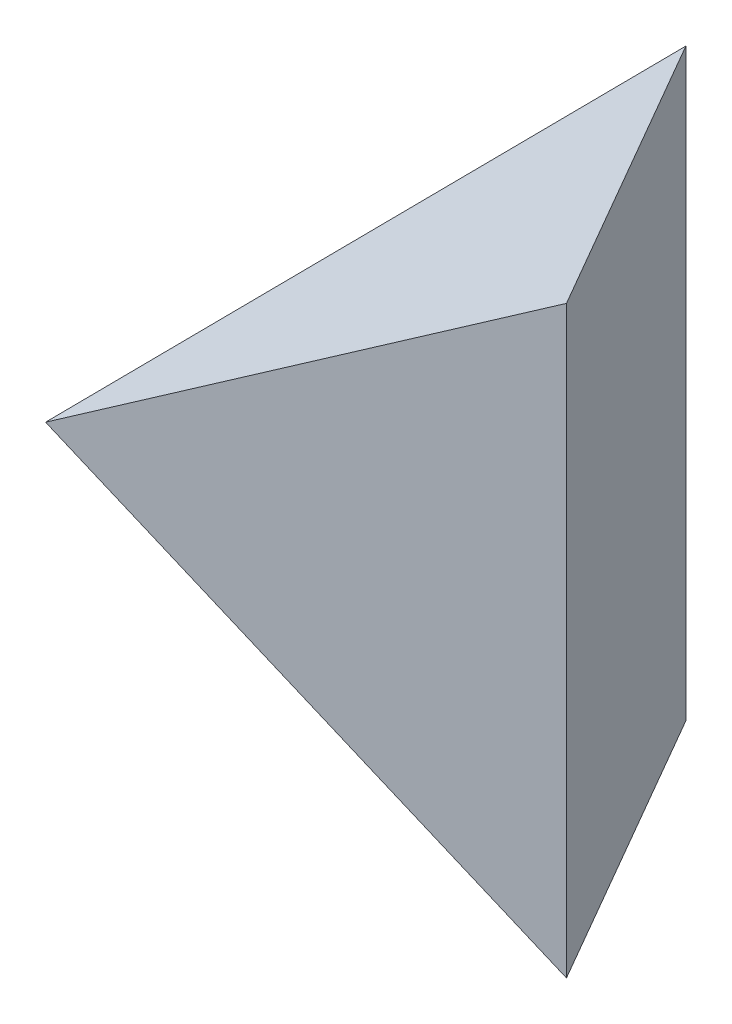
ISO-10303-21;
HEADER;
FILE_DESCRIPTION(('STEP AP214'),'2;1');
FILE_NAME('part.step','',(''),(''),'','','');
FILE_SCHEMA(('AUTOMOTIVE_DESIGN { 1 0 10303 214 1 1 1 1 }'));
ENDSEC;
DATA;
#1=APPLICATION_CONTEXT('core data for automotive mechanical design processes');
#2=APPLICATION_PROTOCOL_DEFINITION('international standard','automotive_design',2000,#1);
#3=PRODUCT_CONTEXT('',#1,'mechanical');
#4=PRODUCT('Part','Part','',(#3));
#5=PRODUCT_RELATED_PRODUCT_CATEGORY('part','',(#4));
#6=PRODUCT_DEFINITION_FORMATION('','',#4);
#7=PRODUCT_DEFINITION_CONTEXT('part definition',#1,'design');
#8=PRODUCT_DEFINITION('design','',#6,#7);
#9=PRODUCT_DEFINITION_SHAPE('','',#8);
#10=(LENGTH_UNIT() NAMED_UNIT(*) SI_UNIT(.MILLI.,.METRE.));
#11=(NAMED_UNIT(*) PLANE_ANGLE_UNIT() SI_UNIT($,.RADIAN.));
#12=(NAMED_UNIT(*) SI_UNIT($,.STERADIAN.) SOLID_ANGLE_UNIT());
#13=UNCERTAINTY_MEASURE_WITH_UNIT(LENGTH_MEASURE(1.E-05),#10,'distance_accuracy_value','');
#14=(GEOMETRIC_REPRESENTATION_CONTEXT(3) GLOBAL_UNCERTAINTY_ASSIGNED_CONTEXT((#13)) GLOBAL_UNIT_ASSIGNED_CONTEXT((#10,
#11,#12)) REPRESENTATION_CONTEXT('',''));
#15=CARTESIAN_POINT('',(0.,0.,0.));
#16=DIRECTION('',(0.,0.,1.));
#17=DIRECTION('',(1.,0.,0.));
#18=AXIS2_PLACEMENT_3D('',#15,#16,#17);
#19=CARTESIAN_POINT('',(726.97871065107,376.1404793008,105.06800296993));
#20=DIRECTION('',(-0.866025403784329,0.,0.50000000000019));
#21=DIRECTION('',(0.,1.,0.));
#22=AXIS2_PLACEMENT_3D('',#19,#20,#21);
#23=PLANE('',#22);
#24=DIRECTION('',(0.,-1.,0.));
#25=VECTOR('',#24,1.);
#26=CARTESIAN_POINT('',(726.97871065107,376.1404793008,105.06800296993));
#27=LINE('',#26,#25);
#28=CARTESIAN_POINT('',(726.97871065107,376.1404793008,105.06800296993));
#29=VERTEX_POINT('',#28);
#30=CARTESIAN_POINT('',(726.97871065107,-311.1404793008,105.06800296993));
#31=VERTEX_POINT('',#30);
#32=EDGE_CURVE('E84',#29,#31,#27,.T.);
#33=ORIENTED_EDGE('',*,*,#32,.T.);
#34=DIRECTION('',(-0.50000000000019,0.,-0.866025403784329));
#35=VECTOR('',#34,1.);
#36=CARTESIAN_POINT('',(726.97871065107,-311.1404793008,105.06800296993));
#37=LINE('',#36,#35);
#38=CARTESIAN_POINT('',(535.04669313336,-311.1404793008,-227.3680029699));
#39=VERTEX_POINT('',#38);
#40=EDGE_CURVE('E113',#31,#39,#37,.T.);
#41=ORIENTED_EDGE('',*,*,#40,.T.);
#42=DIRECTION('',(0.,1.,0.));
#43=VECTOR('',#42,1.);
#44=CARTESIAN_POINT('',(535.04669313336,-311.1404793008,-227.3680029699));
#45=LINE('',#44,#43);
#46=CARTESIAN_POINT('',(535.04669313336,376.1404793008,-227.3680029699));
#47=VERTEX_POINT('',#46);
#48=EDGE_CURVE('E76',#39,#47,#45,.T.);
#49=ORIENTED_EDGE('',*,*,#48,.T.);
#50=DIRECTION('',(0.50000000000019,0.,0.866025403784329));
#51=VECTOR('',#50,1.);
#52=CARTESIAN_POINT('',(535.04669313336,376.1404793008,-227.3680029699));
#53=LINE('',#52,#51);
#54=EDGE_CURVE('E9',#47,#29,#53,.T.);
#55=ORIENTED_EDGE('',*,*,#54,.T.);
#56=EDGE_LOOP('',(#33,#41,#49,#55));
#57=FACE_BOUND('',#56,.T.);
#58=ADVANCED_FACE('F14',(#57),#23,.F.);
#59=CARTESIAN_POINT('',(198.52897871065,32.843640479301,188.76621800297));
#60=DIRECTION('',(-0.866025403784329,0.,0.50000000000019));
#61=DIRECTION('',(0.,1.,0.));
#62=AXIS2_PLACEMENT_3D('',#59,#60,#61);
#63=PLANE('',#62);
#64=DIRECTION('',(0.50000000000019,0.,0.866025403784329));
#65=VECTOR('',#64,1.);
#66=CARTESIAN_POINT('',(198.33704669313,32.843640479301,188.43378199703));
#67=LINE('',#66,#65);
#68=CARTESIAN_POINT('',(198.33704669313,32.843640479301,188.43378199703));
#69=VERTEX_POINT('',#68);
#70=CARTESIAN_POINT('',(198.52897871065,32.843640479301,188.76621800297));
#71=VERTEX_POINT('',#70);
#72=EDGE_CURVE('E28',#69,#71,#67,.T.);
#73=ORIENTED_EDGE('',*,*,#72,.F.);
#74=DIRECTION('',(0.,1.,0.));
#75=VECTOR('',#74,1.);
#76=CARTESIAN_POINT('',(198.33704669313,32.156359520699,188.43378199703));
#77=LINE('',#76,#75);
#78=CARTESIAN_POINT('',(198.33704669313,32.156359520699,188.43378199703));
#79=VERTEX_POINT('',#78);
#80=EDGE_CURVE('E119',#79,#69,#77,.T.);
#81=ORIENTED_EDGE('',*,*,#80,.F.);
#82=DIRECTION('',(-0.50000000000019,0.,-0.866025403784329));
#83=VECTOR('',#82,1.);
#84=CARTESIAN_POINT('',(198.52897871065,32.156359520699,188.76621800297));
#85=LINE('',#84,#83);
#86=CARTESIAN_POINT('',(198.52897871065,32.156359520699,188.76621800297));
#87=VERTEX_POINT('',#86);
#88=EDGE_CURVE('E86',#87,#79,#85,.T.);
#89=ORIENTED_EDGE('',*,*,#88,.F.);
#90=DIRECTION('',(0.,-1.,0.));
#91=VECTOR('',#90,1.);
#92=CARTESIAN_POINT('',(198.52897871065,32.843640479301,188.76621800297));
#93=LINE('',#92,#91);
#94=EDGE_CURVE('E82',#71,#87,#93,.T.);
#95=ORIENTED_EDGE('',*,*,#94,.F.);
#96=EDGE_LOOP('',(#73,#81,#89,#95));
#97=FACE_BOUND('',#96,.T.);
#98=ADVANCED_FACE('F88',(#97),#63,.T.);
#99=CARTESIAN_POINT('',(198.33704669313,32.843640479301,188.43378199703));
#100=CARTESIAN_POINT('',(535.04669313336,376.1404793008,-227.3680029699));
#101=CARTESIAN_POINT('',(198.52897871065,32.843640479301,188.76621800297));
#102=CARTESIAN_POINT('',(726.97871065107,376.1404793008,105.06800296993));
#103=(BOUNDED_SURFACE() B_SPLINE_SURFACE(1,1,((#99,#100),(#101,#102)),.UNSPECIFIED.,.F.,.F.,
.F.) B_SPLINE_SURFACE_WITH_KNOTS((2,2),(2,2),(0.,383.86403503541),(0.,1.),
.UNSPECIFIED.) GEOMETRIC_REPRESENTATION_ITEM() RATIONAL_B_SPLINE_SURFACE(((1.,1.),(1.,1.))) REPRESENTATION_ITEM('') SURFACE());
#104=CARTESIAN_POINT('',(198.52897871065,32.843640479301,188.76621800297));
#105=CARTESIAN_POINT('',(726.97871065107,376.1404793008,105.06800296993));
#106=(BOUNDED_CURVE() B_SPLINE_CURVE(1,(#104,#105),.UNSPECIFIED.,.F.,
.F.) B_SPLINE_CURVE_WITH_KNOTS((2,2),(0.,1.),
.UNSPECIFIED.) CURVE() GEOMETRIC_REPRESENTATION_ITEM() RATIONAL_B_SPLINE_CURVE((1.,1.)) REPRESENTATION_ITEM(''));
#107=EDGE_CURVE('E71',#71,#29,#106,.T.);
#108=CARTESIAN_POINT('',(198.33704669313,32.843640479301,188.43378199703));
#109=CARTESIAN_POINT('',(535.04669313336,376.1404793008,-227.3680029699));
#110=(BOUNDED_CURVE() B_SPLINE_CURVE(1,(#108,#109),.UNSPECIFIED.,.F.,
.F.) B_SPLINE_CURVE_WITH_KNOTS((2,2),(0.,1.),
.UNSPECIFIED.) CURVE() GEOMETRIC_REPRESENTATION_ITEM() RATIONAL_B_SPLINE_CURVE((1.,1.)) REPRESENTATION_ITEM(''));
#111=EDGE_CURVE('E20',#69,#47,#110,.T.);
#112=ORIENTED_EDGE('',*,*,#72,.T.);
#113=ORIENTED_EDGE('',*,*,#107,.T.);
#114=ORIENTED_EDGE('',*,*,#54,.F.);
#115=ORIENTED_EDGE('',*,*,#111,.F.);
#116=EDGE_LOOP('',(#112,#113,#114,#115));
#117=FACE_BOUND('',#116,.T.);
#118=ADVANCED_FACE('F16',(#117),#103,.T.);
#119=CARTESIAN_POINT('',(198.33704669313,32.156359520699,188.43378199703));
#120=CARTESIAN_POINT('',(535.04669313336,-311.1404793008,-227.3680029699));
#121=CARTESIAN_POINT('',(198.33704669313,32.843640479301,188.43378199703));
#122=CARTESIAN_POINT('',(535.04669313336,376.1404793008,-227.3680029699));
#123=(BOUNDED_SURFACE() B_SPLINE_SURFACE(1,1,((#119,#120),(#121,#122)),.UNSPECIFIED.,.F.,.F.,
.F.) B_SPLINE_SURFACE_WITH_KNOTS((2,2),(2,2),(0.,687.28095860161),(0.,1.),
.UNSPECIFIED.) GEOMETRIC_REPRESENTATION_ITEM() RATIONAL_B_SPLINE_SURFACE(((1.,1.),(1.,1.))) REPRESENTATION_ITEM('') SURFACE());
#124=CARTESIAN_POINT('',(198.33704669313,32.156359520699,188.43378199703));
#125=CARTESIAN_POINT('',(535.04669313336,-311.1404793008,-227.3680029699));
#126=(BOUNDED_CURVE() B_SPLINE_CURVE(1,(#124,#125),.UNSPECIFIED.,.F.,
.F.) B_SPLINE_CURVE_WITH_KNOTS((2,2),(0.,1.),
.UNSPECIFIED.) CURVE() GEOMETRIC_REPRESENTATION_ITEM() RATIONAL_B_SPLINE_CURVE((1.,1.)) REPRESENTATION_ITEM(''));
#127=EDGE_CURVE('E107',#79,#39,#126,.T.);
#128=ORIENTED_EDGE('',*,*,#80,.T.);
#129=ORIENTED_EDGE('',*,*,#111,.T.);
#130=ORIENTED_EDGE('',*,*,#48,.F.);
#131=ORIENTED_EDGE('',*,*,#127,.F.);
#132=EDGE_LOOP('',(#128,#129,#130,#131));
#133=FACE_BOUND('',#132,.T.);
#134=ADVANCED_FACE('F134',(#133),#123,.T.);
#135=CARTESIAN_POINT('',(198.52897871065,32.156359520699,188.76621800297));
#136=CARTESIAN_POINT('',(726.97871065107,-311.1404793008,105.06800296993));
#137=CARTESIAN_POINT('',(198.33704669313,32.156359520699,188.43378199703));
#138=CARTESIAN_POINT('',(535.04669313336,-311.1404793008,-227.3680029699));
#139=(BOUNDED_SURFACE() B_SPLINE_SURFACE(1,1,((#135,#136),(#137,#138)),.UNSPECIFIED.,.F.,.F.,
.F.) B_SPLINE_SURFACE_WITH_KNOTS((2,2),(2,2),(0.,383.86403503541),(0.,1.),
.UNSPECIFIED.) GEOMETRIC_REPRESENTATION_ITEM() RATIONAL_B_SPLINE_SURFACE(((1.,1.),(1.,1.))) REPRESENTATION_ITEM('') SURFACE());
#140=CARTESIAN_POINT('',(198.52897871065,32.156359520699,188.76621800297));
#141=CARTESIAN_POINT('',(726.97871065107,-311.1404793008,105.06800296993));
#142=(BOUNDED_CURVE() B_SPLINE_CURVE(1,(#140,#141),.UNSPECIFIED.,.F.,
.F.) B_SPLINE_CURVE_WITH_KNOTS((2,2),(0.,1.),
.UNSPECIFIED.) CURVE() GEOMETRIC_REPRESENTATION_ITEM() RATIONAL_B_SPLINE_CURVE((1.,1.)) REPRESENTATION_ITEM(''));
#143=EDGE_CURVE('E92',#87,#31,#142,.T.);
#144=ORIENTED_EDGE('',*,*,#88,.T.);
#145=ORIENTED_EDGE('',*,*,#127,.T.);
#146=ORIENTED_EDGE('',*,*,#40,.F.);
#147=ORIENTED_EDGE('',*,*,#143,.F.);
#148=EDGE_LOOP('',(#144,#145,#146,#147));
#149=FACE_BOUND('',#148,.T.);
#150=ADVANCED_FACE('F136',(#149),#139,.T.);
#151=CARTESIAN_POINT('',(198.52897871065,32.843640479301,188.76621800297));
#152=CARTESIAN_POINT('',(726.97871065107,376.1404793008,105.06800296993));
#153=CARTESIAN_POINT('',(198.52897871065,32.156359520699,188.76621800297));
#154=CARTESIAN_POINT('',(726.97871065107,-311.1404793008,105.06800296993));
#155=(BOUNDED_SURFACE() B_SPLINE_SURFACE(1,1,((#151,#152),(#153,#154)),.UNSPECIFIED.,.F.,.F.,
.F.) B_SPLINE_SURFACE_WITH_KNOTS((2,2),(2,2),(0.,687.28095860161),(0.,1.),
.UNSPECIFIED.) GEOMETRIC_REPRESENTATION_ITEM() RATIONAL_B_SPLINE_SURFACE(((1.,1.),(1.,1.))) REPRESENTATION_ITEM('') SURFACE());
#156=ORIENTED_EDGE('',*,*,#94,.T.);
#157=ORIENTED_EDGE('',*,*,#143,.T.);
#158=ORIENTED_EDGE('',*,*,#32,.F.);
#159=ORIENTED_EDGE('',*,*,#107,.F.);
#160=EDGE_LOOP('',(#156,#157,#158,#159));
#161=FACE_BOUND('',#160,.T.);
#162=ADVANCED_FACE('F80',(#161),#155,.T.);
#163=CLOSED_SHELL('',(#58,#98,#118,#134,#150,#162));
#164=MANIFOLD_SOLID_BREP('B1',#163);
#165=ADVANCED_BREP_SHAPE_REPRESENTATION('',(#18,#164),#14);
#166=SHAPE_DEFINITION_REPRESENTATION(#9,#165);
ENDSEC;
END-ISO-10303-21;
